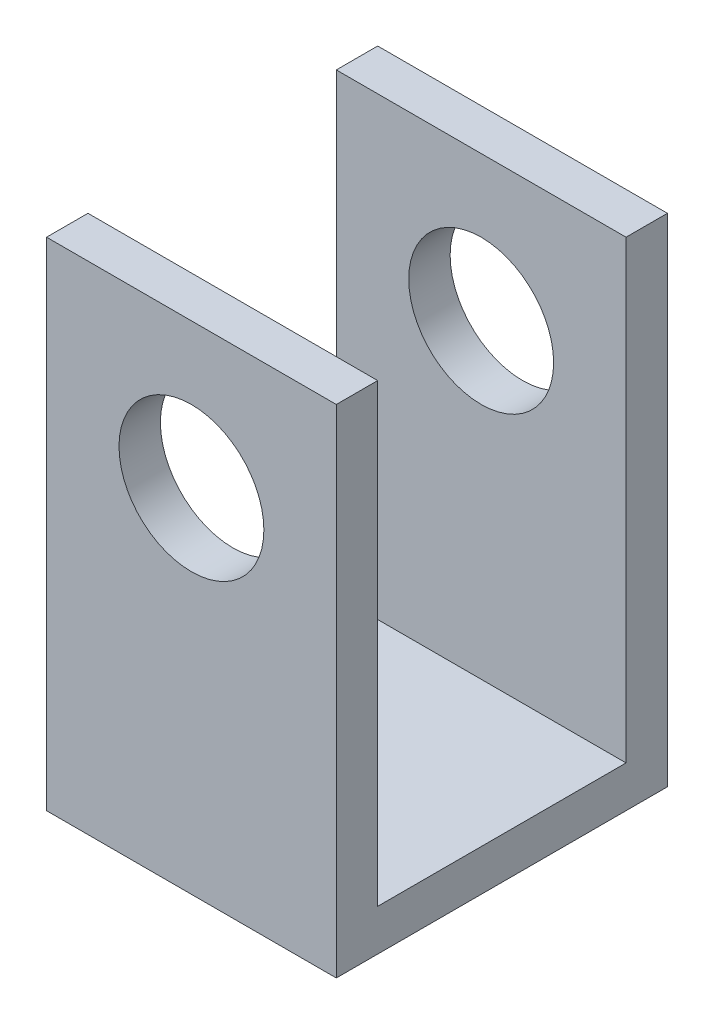
ISO-10303-21;
HEADER;
FILE_DESCRIPTION(('STEP AP214'),'2;1');
FILE_NAME('part.step','',(''),(''),'','','');
FILE_SCHEMA(('AUTOMOTIVE_DESIGN { 1 0 10303 214 1 1 1 1 }'));
ENDSEC;
DATA;
#1=APPLICATION_CONTEXT('core data for automotive mechanical design processes');
#2=APPLICATION_PROTOCOL_DEFINITION('international standard','automotive_design',2000,#1);
#3=PRODUCT_CONTEXT('',#1,'mechanical');
#4=PRODUCT('Part','Part','',(#3));
#5=PRODUCT_RELATED_PRODUCT_CATEGORY('part','',(#4));
#6=PRODUCT_DEFINITION_FORMATION('','',#4);
#7=PRODUCT_DEFINITION_CONTEXT('part definition',#1,'design');
#8=PRODUCT_DEFINITION('design','',#6,#7);
#9=PRODUCT_DEFINITION_SHAPE('','',#8);
#10=(LENGTH_UNIT() NAMED_UNIT(*) SI_UNIT(.MILLI.,.METRE.));
#11=(NAMED_UNIT(*) PLANE_ANGLE_UNIT() SI_UNIT($,.RADIAN.));
#12=(NAMED_UNIT(*) SI_UNIT($,.STERADIAN.) SOLID_ANGLE_UNIT());
#13=UNCERTAINTY_MEASURE_WITH_UNIT(LENGTH_MEASURE(1.E-05),#10,'distance_accuracy_value','');
#14=(GEOMETRIC_REPRESENTATION_CONTEXT(3) GLOBAL_UNCERTAINTY_ASSIGNED_CONTEXT((#13)) GLOBAL_UNIT_ASSIGNED_CONTEXT((#10,
#11,#12)) REPRESENTATION_CONTEXT('',''));
#15=CARTESIAN_POINT('',(0.,0.,0.));
#16=DIRECTION('',(0.,0.,1.));
#17=DIRECTION('',(1.,0.,0.));
#18=AXIS2_PLACEMENT_3D('',#15,#16,#17);
#19=CARTESIAN_POINT('',(0.,120.,80.));
#20=DIRECTION('',(0.,-1.,0.));
#21=DIRECTION('',(1.,0.,0.));
#22=AXIS2_PLACEMENT_3D('',#19,#20,#21);
#23=PLANE('',#22);
#24=DIRECTION('',(0.,0.,-1.));
#25=VECTOR('',#24,1.);
#26=CARTESIAN_POINT('',(0.,120.,80.));
#27=LINE('',#26,#25);
#28=CARTESIAN_POINT('',(0.,120.,10.));
#29=VERTEX_POINT('',#28);
#30=CARTESIAN_POINT('',(0.,120.,0.));
#31=VERTEX_POINT('',#30);
#32=EDGE_CURVE('E88',#29,#31,#27,.T.);
#33=ORIENTED_EDGE('',*,*,#32,.F.);
#34=DIRECTION('',(-1.,0.,0.));
#35=VECTOR('',#34,1.);
#36=CARTESIAN_POINT('',(0.,120.,10.));
#37=LINE('',#36,#35);
#38=CARTESIAN_POINT('',(70.,120.,10.));
#39=VERTEX_POINT('',#38);
#40=EDGE_CURVE('E132',#39,#29,#37,.T.);
#41=ORIENTED_EDGE('',*,*,#40,.F.);
#42=DIRECTION('',(0.,0.,-1.));
#43=VECTOR('',#42,1.);
#44=CARTESIAN_POINT('',(70.,120.,80.));
#45=LINE('',#44,#43);
#46=CARTESIAN_POINT('',(70.,120.,0.));
#47=VERTEX_POINT('',#46);
#48=EDGE_CURVE('E179',#39,#47,#45,.T.);
#49=ORIENTED_EDGE('',*,*,#48,.T.);
#50=DIRECTION('',(-1.,0.,0.));
#51=VECTOR('',#50,1.);
#52=CARTESIAN_POINT('',(0.,120.,0.));
#53=LINE('',#52,#51);
#54=EDGE_CURVE('E158',#47,#31,#53,.T.);
#55=ORIENTED_EDGE('',*,*,#54,.T.);
#56=EDGE_LOOP('',(#33,#41,#49,#55));
#57=FACE_BOUND('',#56,.T.);
#58=ADVANCED_FACE('F39',(#57),#23,.F.);
#59=CARTESIAN_POINT('',(35.,85.,80.));
#60=DIRECTION('',(0.,0.,-1.));
#61=DIRECTION('',(-1.,0.,0.));
#62=AXIS2_PLACEMENT_3D('',#59,#60,#61);
#63=CYLINDRICAL_SURFACE('',#62,17.5);
#64=CARTESIAN_POINT('',(35.,85.,9.99999999999999));
#65=DIRECTION('',(0.,0.,-1.));
#66=DIRECTION('',(-1.,0.,0.));
#67=AXIS2_PLACEMENT_3D('',#64,#65,#66);
#68=CIRCLE('',#67,17.5);
#69=CARTESIAN_POINT('',(17.5,85.,9.99999999999999));
#70=VERTEX_POINT('',#69);
#71=EDGE_CURVE('E43',#70,#70,#68,.T.);
#72=ORIENTED_EDGE('',*,*,#71,.F.);
#73=EDGE_LOOP('',(#72));
#74=FACE_BOUND('',#73,.T.);
#75=CARTESIAN_POINT('',(35.,85.,0.));
#76=DIRECTION('',(0.,0.,1.));
#77=DIRECTION('',(1.,0.,0.));
#78=AXIS2_PLACEMENT_3D('',#75,#76,#77);
#79=CIRCLE('',#78,17.5);
#80=CARTESIAN_POINT('',(52.5,85.,0.));
#81=VERTEX_POINT('',#80);
#82=EDGE_CURVE('E151',#81,#81,#79,.T.);
#83=ORIENTED_EDGE('',*,*,#82,.F.);
#84=EDGE_LOOP('',(#83));
#85=FACE_BOUND('',#84,.T.);
#86=ADVANCED_FACE('F227',(#74,#85),#63,.F.);
#87=CARTESIAN_POINT('',(0.,0.,80.));
#88=DIRECTION('',(0.,0.,-1.));
#89=DIRECTION('',(-1.,0.,0.));
#90=AXIS2_PLACEMENT_3D('',#87,#88,#89);
#91=PLANE('',#90);
#92=DIRECTION('',(0.,-1.,0.));
#93=VECTOR('',#92,1.);
#94=CARTESIAN_POINT('',(0.,0.,80.));
#95=LINE('',#94,#93);
#96=CARTESIAN_POINT('',(0.,120.,80.));
#97=VERTEX_POINT('',#96);
#98=CARTESIAN_POINT('',(0.,0.,80.));
#99=VERTEX_POINT('',#98);
#100=EDGE_CURVE('E155',#97,#99,#95,.T.);
#101=ORIENTED_EDGE('',*,*,#100,.T.);
#102=DIRECTION('',(1.,0.,0.));
#103=VECTOR('',#102,1.);
#104=CARTESIAN_POINT('',(0.,0.,80.));
#105=LINE('',#104,#103);
#106=CARTESIAN_POINT('',(70.,0.,80.));
#107=VERTEX_POINT('',#106);
#108=EDGE_CURVE('E95',#99,#107,#105,.T.);
#109=ORIENTED_EDGE('',*,*,#108,.T.);
#110=DIRECTION('',(0.,1.,0.));
#111=VECTOR('',#110,1.);
#112=CARTESIAN_POINT('',(70.,0.,80.));
#113=LINE('',#112,#111);
#114=CARTESIAN_POINT('',(70.,120.,80.));
#115=VERTEX_POINT('',#114);
#116=EDGE_CURVE('E161',#107,#115,#113,.T.);
#117=ORIENTED_EDGE('',*,*,#116,.T.);
#118=DIRECTION('',(-1.,0.,0.));
#119=VECTOR('',#118,1.);
#120=CARTESIAN_POINT('',(0.,120.,80.));
#121=LINE('',#120,#119);
#122=EDGE_CURVE('E66',#115,#97,#121,.T.);
#123=ORIENTED_EDGE('',*,*,#122,.T.);
#124=EDGE_LOOP('',(#101,#109,#117,#123));
#125=FACE_BOUND('',#124,.T.);
#126=CARTESIAN_POINT('',(35.,85.,80.));
#127=DIRECTION('',(0.,0.,1.));
#128=DIRECTION('',(1.,0.,0.));
#129=AXIS2_PLACEMENT_3D('',#126,#127,#128);
#130=CIRCLE('',#129,17.5);
#131=CARTESIAN_POINT('',(52.5,85.,80.));
#132=VERTEX_POINT('',#131);
#133=EDGE_CURVE('E146',#132,#132,#130,.T.);
#134=ORIENTED_EDGE('',*,*,#133,.F.);
#135=EDGE_LOOP('',(#134));
#136=FACE_BOUND('',#135,.T.);
#137=ADVANCED_FACE('F224',(#125,#136),#91,.F.);
#138=CARTESIAN_POINT('',(0.,0.,0.));
#139=DIRECTION('',(0.,0.,-1.));
#140=DIRECTION('',(-1.,0.,0.));
#141=AXIS2_PLACEMENT_3D('',#138,#139,#140);
#142=PLANE('',#141);
#143=DIRECTION('',(0.,-1.,0.));
#144=VECTOR('',#143,1.);
#145=CARTESIAN_POINT('',(0.,0.,0.));
#146=LINE('',#145,#144);
#147=CARTESIAN_POINT('',(0.,0.,0.));
#148=VERTEX_POINT('',#147);
#149=EDGE_CURVE('E150',#31,#148,#146,.T.);
#150=ORIENTED_EDGE('',*,*,#149,.F.);
#151=ORIENTED_EDGE('',*,*,#54,.F.);
#152=DIRECTION('',(0.,1.,0.));
#153=VECTOR('',#152,1.);
#154=CARTESIAN_POINT('',(70.,0.,0.));
#155=LINE('',#154,#153);
#156=CARTESIAN_POINT('',(70.,0.,0.));
#157=VERTEX_POINT('',#156);
#158=EDGE_CURVE('E171',#157,#47,#155,.T.);
#159=ORIENTED_EDGE('',*,*,#158,.F.);
#160=DIRECTION('',(1.,0.,0.));
#161=VECTOR('',#160,1.);
#162=CARTESIAN_POINT('',(0.,0.,0.));
#163=LINE('',#162,#161);
#164=EDGE_CURVE('E168',#148,#157,#163,.T.);
#165=ORIENTED_EDGE('',*,*,#164,.F.);
#166=EDGE_LOOP('',(#150,#151,#159,#165));
#167=FACE_BOUND('',#166,.T.);
#168=ORIENTED_EDGE('',*,*,#82,.T.);
#169=EDGE_LOOP('',(#168));
#170=FACE_BOUND('',#169,.T.);
#171=ADVANCED_FACE('F218',(#167,#170),#142,.T.);
#172=CARTESIAN_POINT('',(0.,0.,80.));
#173=DIRECTION('',(1.,0.,0.));
#174=DIRECTION('',(0.,0.,-1.));
#175=AXIS2_PLACEMENT_3D('',#172,#173,#174);
#176=PLANE('',#175);
#177=DIRECTION('',(0.,0.,1.));
#178=VECTOR('',#177,1.);
#179=CARTESIAN_POINT('',(0.,10.,10.));
#180=LINE('',#179,#178);
#181=CARTESIAN_POINT('',(0.,10.,10.));
#182=VERTEX_POINT('',#181);
#183=CARTESIAN_POINT('',(0.,10.,70.));
#184=VERTEX_POINT('',#183);
#185=EDGE_CURVE('E124',#182,#184,#180,.T.);
#186=ORIENTED_EDGE('',*,*,#185,.F.);
#187=DIRECTION('',(0.,1.,0.));
#188=VECTOR('',#187,1.);
#189=CARTESIAN_POINT('',(0.,10.,10.));
#190=LINE('',#189,#188);
#191=EDGE_CURVE('E189',#182,#29,#190,.T.);
#192=ORIENTED_EDGE('',*,*,#191,.T.);
#193=ORIENTED_EDGE('',*,*,#32,.T.);
#194=ORIENTED_EDGE('',*,*,#149,.T.);
#195=DIRECTION('',(0.,0.,-1.));
#196=VECTOR('',#195,1.);
#197=CARTESIAN_POINT('',(0.,0.,80.));
#198=LINE('',#197,#196);
#199=EDGE_CURVE('E11',#99,#148,#198,.T.);
#200=ORIENTED_EDGE('',*,*,#199,.F.);
#201=ORIENTED_EDGE('',*,*,#100,.F.);
#202=CARTESIAN_POINT('',(0.,120.,70.));
#203=VERTEX_POINT('',#202);
#204=EDGE_CURVE('E136',#97,#203,#27,.T.);
#205=ORIENTED_EDGE('',*,*,#204,.T.);
#206=DIRECTION('',(0.,1.,0.));
#207=VECTOR('',#206,1.);
#208=CARTESIAN_POINT('',(0.,10.,70.));
#209=LINE('',#208,#207);
#210=EDGE_CURVE('E57',#184,#203,#209,.T.);
#211=ORIENTED_EDGE('',*,*,#210,.F.);
#212=EDGE_LOOP('',(#186,#192,#193,#194,#200,#201,#205,#211));
#213=FACE_BOUND('',#212,.T.);
#214=ADVANCED_FACE('F41',(#213),#176,.F.);
#215=CARTESIAN_POINT('',(0.,0.,80.));
#216=DIRECTION('',(0.,1.,0.));
#217=DIRECTION('',(-1.,0.,0.));
#218=AXIS2_PLACEMENT_3D('',#215,#216,#217);
#219=PLANE('',#218);
#220=ORIENTED_EDGE('',*,*,#164,.T.);
#221=DIRECTION('',(0.,0.,-1.));
#222=VECTOR('',#221,1.);
#223=CARTESIAN_POINT('',(70.,0.,80.));
#224=LINE('',#223,#222);
#225=EDGE_CURVE('E49',#107,#157,#224,.T.);
#226=ORIENTED_EDGE('',*,*,#225,.F.);
#227=ORIENTED_EDGE('',*,*,#108,.F.);
#228=ORIENTED_EDGE('',*,*,#199,.T.);
#229=EDGE_LOOP('',(#220,#226,#227,#228));
#230=FACE_BOUND('',#229,.T.);
#231=ADVANCED_FACE('F221',(#230),#219,.F.);
#232=CARTESIAN_POINT('',(70.,0.,80.));
#233=DIRECTION('',(-1.,0.,0.));
#234=DIRECTION('',(0.,-1.,0.));
#235=AXIS2_PLACEMENT_3D('',#232,#233,#234);
#236=PLANE('',#235);
#237=ORIENTED_EDGE('',*,*,#48,.F.);
#238=DIRECTION('',(0.,1.,0.));
#239=VECTOR('',#238,1.);
#240=CARTESIAN_POINT('',(70.,10.,10.));
#241=LINE('',#240,#239);
#242=CARTESIAN_POINT('',(70.,10.,10.));
#243=VERTEX_POINT('',#242);
#244=EDGE_CURVE('E141',#243,#39,#241,.T.);
#245=ORIENTED_EDGE('',*,*,#244,.F.);
#246=DIRECTION('',(0.,0.,-1.));
#247=VECTOR('',#246,1.);
#248=CARTESIAN_POINT('',(70.,10.,10.));
#249=LINE('',#248,#247);
#250=CARTESIAN_POINT('',(70.,10.,70.));
#251=VERTEX_POINT('',#250);
#252=EDGE_CURVE('E123',#251,#243,#249,.T.);
#253=ORIENTED_EDGE('',*,*,#252,.F.);
#254=DIRECTION('',(0.,1.,0.));
#255=VECTOR('',#254,1.);
#256=CARTESIAN_POINT('',(70.,10.,70.));
#257=LINE('',#256,#255);
#258=CARTESIAN_POINT('',(70.,120.,70.));
#259=VERTEX_POINT('',#258);
#260=EDGE_CURVE('E119',#251,#259,#257,.T.);
#261=ORIENTED_EDGE('',*,*,#260,.T.);
#262=EDGE_CURVE('E180',#115,#259,#45,.T.);
#263=ORIENTED_EDGE('',*,*,#262,.F.);
#264=ORIENTED_EDGE('',*,*,#116,.F.);
#265=ORIENTED_EDGE('',*,*,#225,.T.);
#266=ORIENTED_EDGE('',*,*,#158,.T.);
#267=EDGE_LOOP('',(#237,#245,#253,#261,#263,#264,#265,#266));
#268=FACE_BOUND('',#267,.T.);
#269=ADVANCED_FACE('F210',(#268),#236,.F.);
#270=ORIENTED_EDGE('',*,*,#262,.T.);
#271=DIRECTION('',(1.,0.,0.));
#272=VECTOR('',#271,1.);
#273=CARTESIAN_POINT('',(0.,120.,70.));
#274=LINE('',#273,#272);
#275=EDGE_CURVE('E200',#203,#259,#274,.T.);
#276=ORIENTED_EDGE('',*,*,#275,.F.);
#277=ORIENTED_EDGE('',*,*,#204,.F.);
#278=ORIENTED_EDGE('',*,*,#122,.F.);
#279=EDGE_LOOP('',(#270,#276,#277,#278));
#280=FACE_BOUND('',#279,.T.);
#281=ADVANCED_FACE('F233',(#280),#23,.F.);
#282=CARTESIAN_POINT('',(35.,85.,70.));
#283=DIRECTION('',(0.,0.,1.));
#284=DIRECTION('',(1.,0.,0.));
#285=AXIS2_PLACEMENT_3D('',#282,#283,#284);
#286=CIRCLE('',#285,17.5);
#287=CARTESIAN_POINT('',(52.5,85.,70.));
#288=VERTEX_POINT('',#287);
#289=EDGE_CURVE('E186',#288,#288,#286,.T.);
#290=ORIENTED_EDGE('',*,*,#289,.F.);
#291=EDGE_LOOP('',(#290));
#292=FACE_BOUND('',#291,.T.);
#293=ORIENTED_EDGE('',*,*,#133,.T.);
#294=EDGE_LOOP('',(#293));
#295=FACE_BOUND('',#294,.T.);
#296=ADVANCED_FACE('F231',(#292,#295),#63,.F.);
#297=CARTESIAN_POINT('',(0.,10.,10.));
#298=DIRECTION('',(0.,0.,-1.));
#299=DIRECTION('',(-1.,0.,0.));
#300=AXIS2_PLACEMENT_3D('',#297,#298,#299);
#301=PLANE('',#300);
#302=ORIENTED_EDGE('',*,*,#71,.T.);
#303=EDGE_LOOP('',(#302));
#304=FACE_BOUND('',#303,.T.);
#305=ORIENTED_EDGE('',*,*,#40,.T.);
#306=ORIENTED_EDGE('',*,*,#191,.F.);
#307=DIRECTION('',(-1.,0.,0.));
#308=VECTOR('',#307,1.);
#309=CARTESIAN_POINT('',(0.,10.,10.));
#310=LINE('',#309,#308);
#311=EDGE_CURVE('E130',#243,#182,#310,.T.);
#312=ORIENTED_EDGE('',*,*,#311,.F.);
#313=ORIENTED_EDGE('',*,*,#244,.T.);
#314=EDGE_LOOP('',(#305,#306,#312,#313));
#315=FACE_BOUND('',#314,.T.);
#316=ADVANCED_FACE('F207',(#304,#315),#301,.F.);
#317=CARTESIAN_POINT('',(0.,10.,70.));
#318=DIRECTION('',(0.,0.,1.));
#319=DIRECTION('',(1.,0.,0.));
#320=AXIS2_PLACEMENT_3D('',#317,#318,#319);
#321=PLANE('',#320);
#322=ORIENTED_EDGE('',*,*,#289,.T.);
#323=EDGE_LOOP('',(#322));
#324=FACE_BOUND('',#323,.T.);
#325=ORIENTED_EDGE('',*,*,#275,.T.);
#326=ORIENTED_EDGE('',*,*,#260,.F.);
#327=DIRECTION('',(1.,0.,0.));
#328=VECTOR('',#327,1.);
#329=CARTESIAN_POINT('',(0.,10.,70.));
#330=LINE('',#329,#328);
#331=EDGE_CURVE('E115',#184,#251,#330,.T.);
#332=ORIENTED_EDGE('',*,*,#331,.F.);
#333=ORIENTED_EDGE('',*,*,#210,.T.);
#334=EDGE_LOOP('',(#325,#326,#332,#333));
#335=FACE_BOUND('',#334,.T.);
#336=ADVANCED_FACE('F117',(#324,#335),#321,.F.);
#337=CARTESIAN_POINT('',(0.,10.,0.));
#338=DIRECTION('',(0.,1.,0.));
#339=DIRECTION('',(-1.,0.,0.));
#340=AXIS2_PLACEMENT_3D('',#337,#338,#339);
#341=PLANE('',#340);
#342=ORIENTED_EDGE('',*,*,#185,.T.);
#343=ORIENTED_EDGE('',*,*,#331,.T.);
#344=ORIENTED_EDGE('',*,*,#252,.T.);
#345=ORIENTED_EDGE('',*,*,#311,.T.);
#346=EDGE_LOOP('',(#342,#343,#344,#345));
#347=FACE_BOUND('',#346,.T.);
#348=ADVANCED_FACE('F128',(#347),#341,.T.);
#349=CLOSED_SHELL('',(#58,#86,#137,#171,#214,#231,#269,#281,#296,#316,#336,#348));
#350=MANIFOLD_SOLID_BREP('B2',#349);
#351=ADVANCED_BREP_SHAPE_REPRESENTATION('',(#18,#350),#14);
#352=SHAPE_DEFINITION_REPRESENTATION(#9,#351);
ENDSEC;
END-ISO-10303-21;
